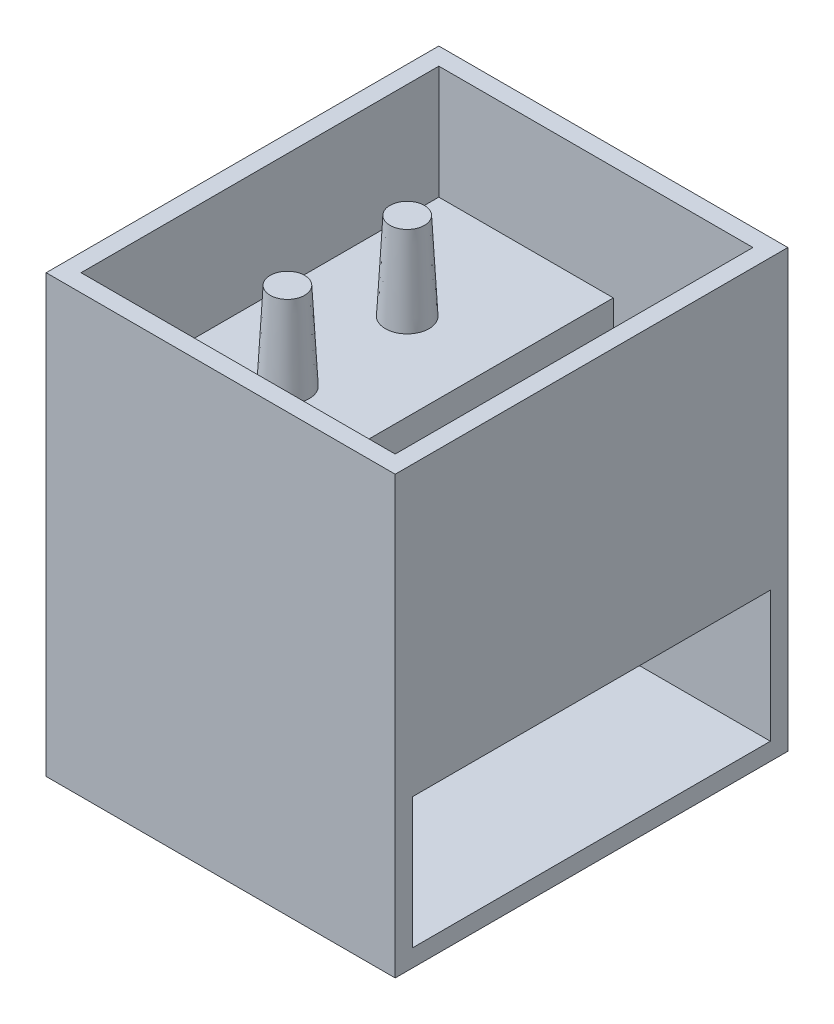
ISO-10303-21;
HEADER;
FILE_DESCRIPTION(('STEP AP214'),'2;1');
FILE_NAME('part.step','',(''),(''),'','','');
FILE_SCHEMA(('AUTOMOTIVE_DESIGN { 1 0 10303 214 1 1 1 1 }'));
ENDSEC;
DATA;
#1=APPLICATION_CONTEXT('core data for automotive mechanical design processes');
#2=APPLICATION_PROTOCOL_DEFINITION('international standard','automotive_design',2000,#1);
#3=PRODUCT_CONTEXT('',#1,'mechanical');
#4=PRODUCT('Part','Part','',(#3));
#5=PRODUCT_RELATED_PRODUCT_CATEGORY('part','',(#4));
#6=PRODUCT_DEFINITION_FORMATION('','',#4);
#7=PRODUCT_DEFINITION_CONTEXT('part definition',#1,'design');
#8=PRODUCT_DEFINITION('design','',#6,#7);
#9=PRODUCT_DEFINITION_SHAPE('','',#8);
#10=(LENGTH_UNIT() NAMED_UNIT(*) SI_UNIT(.MILLI.,.METRE.));
#11=(NAMED_UNIT(*) PLANE_ANGLE_UNIT() SI_UNIT($,.RADIAN.));
#12=(NAMED_UNIT(*) SI_UNIT($,.STERADIAN.) SOLID_ANGLE_UNIT());
#13=UNCERTAINTY_MEASURE_WITH_UNIT(LENGTH_MEASURE(1.E-05),#10,'distance_accuracy_value','');
#14=(GEOMETRIC_REPRESENTATION_CONTEXT(3) GLOBAL_UNCERTAINTY_ASSIGNED_CONTEXT((#13)) GLOBAL_UNIT_ASSIGNED_CONTEXT((#10,
#11,#12)) REPRESENTATION_CONTEXT('',''));
#15=CARTESIAN_POINT('',(0.,0.,0.));
#16=DIRECTION('',(0.,0.,1.));
#17=DIRECTION('',(1.,0.,0.));
#18=AXIS2_PLACEMENT_3D('',#15,#16,#17);
#19=CARTESIAN_POINT('',(-32.8887004628611,50.,-14.0503463635909));
#20=DIRECTION('',(1.,0.,0.));
#21=DIRECTION('',(0.,0.,-1.));
#22=AXIS2_PLACEMENT_3D('',#19,#20,#21);
#23=PLANE('',#22);
#24=DIRECTION('',(0.,-1.,0.));
#25=VECTOR('',#24,1.);
#26=CARTESIAN_POINT('',(-32.8887004628611,50.,28.9496536364091));
#27=LINE('',#26,#25);
#28=CARTESIAN_POINT('',(-32.8887004628611,50.,28.9496536364091));
#29=VERTEX_POINT('',#28);
#30=CARTESIAN_POINT('',(-32.8887004628611,37.,28.9496536364091));
#31=VERTEX_POINT('',#30);
#32=EDGE_CURVE('E193',#29,#31,#27,.T.);
#33=ORIENTED_EDGE('',*,*,#32,.T.);
#34=DIRECTION('',(0.,0.,1.));
#35=VECTOR('',#34,1.);
#36=CARTESIAN_POINT('',(-32.8887004628611,37.,-12.0503463635909));
#37=LINE('',#36,#35);
#38=CARTESIAN_POINT('',(-32.8887004628611,37.,-12.0503463635909));
#39=VERTEX_POINT('',#38);
#40=EDGE_CURVE('E158',#39,#31,#37,.T.);
#41=ORIENTED_EDGE('',*,*,#40,.F.);
#42=DIRECTION('',(0.,-1.,0.));
#43=VECTOR('',#42,1.);
#44=CARTESIAN_POINT('',(-32.8887004628611,50.,-12.0503463635909));
#45=LINE('',#44,#43);
#46=CARTESIAN_POINT('',(-32.8887004628611,50.,-12.0503463635909));
#47=VERTEX_POINT('',#46);
#48=EDGE_CURVE('E140',#47,#39,#45,.T.);
#49=ORIENTED_EDGE('',*,*,#48,.F.);
#50=DIRECTION('',(0.,0.,1.));
#51=VECTOR('',#50,1.);
#52=CARTESIAN_POINT('',(-32.8887004628611,50.,-14.0503463635909));
#53=LINE('',#52,#51);
#54=EDGE_CURVE('E210',#47,#29,#53,.T.);
#55=ORIENTED_EDGE('',*,*,#54,.T.);
#56=EDGE_LOOP('',(#33,#41,#49,#55));
#57=FACE_BOUND('',#56,.T.);
#58=ADVANCED_FACE('F33',(#57),#23,.T.);
#59=CARTESIAN_POINT('',(-32.8887004628611,27.,-12.0503463635909));
#60=VERTEX_POINT('',#59);
#61=CARTESIAN_POINT('',(-32.8887004628611,2.,-12.0503463635909));
#62=VERTEX_POINT('',#61);
#63=EDGE_CURVE('E200',#60,#62,#45,.T.);
#64=ORIENTED_EDGE('',*,*,#63,.F.);
#65=DIRECTION('',(0.,0.,-1.));
#66=VECTOR('',#65,1.);
#67=CARTESIAN_POINT('',(-32.8887004628611,27.,-12.0503463635909));
#68=LINE('',#67,#66);
#69=CARTESIAN_POINT('',(-32.8887004628611,27.,28.9496536364091));
#70=VERTEX_POINT('',#69);
#71=EDGE_CURVE('E155',#70,#60,#68,.T.);
#72=ORIENTED_EDGE('',*,*,#71,.F.);
#73=CARTESIAN_POINT('',(-32.8887004628611,2.,28.9496536364091));
#74=VERTEX_POINT('',#73);
#75=EDGE_CURVE('E197',#70,#74,#27,.T.);
#76=ORIENTED_EDGE('',*,*,#75,.T.);
#77=DIRECTION('',(0.,0.,1.));
#78=VECTOR('',#77,1.);
#79=CARTESIAN_POINT('',(-32.8887004628611,2.,-14.0503463635909));
#80=LINE('',#79,#78);
#81=EDGE_CURVE('E189',#62,#74,#80,.T.);
#82=ORIENTED_EDGE('',*,*,#81,.F.);
#83=EDGE_LOOP('',(#64,#72,#76,#82));
#84=FACE_BOUND('',#83,.T.);
#85=ADVANCED_FACE('F268',(#84),#23,.T.);
#86=CARTESIAN_POINT('',(-34.8887004628611,50.,28.9496536364091));
#87=DIRECTION('',(0.,0.,-1.));
#88=DIRECTION('',(-1.,0.,0.));
#89=AXIS2_PLACEMENT_3D('',#86,#87,#88);
#90=PLANE('',#89);
#91=DIRECTION('',(0.,-1.,0.));
#92=VECTOR('',#91,1.);
#93=CARTESIAN_POINT('',(-12.8887004628611,27.,28.9496536364091));
#94=LINE('',#93,#92);
#95=CARTESIAN_POINT('',(-12.8887004628611,37.,28.9496536364091));
#96=VERTEX_POINT('',#95);
#97=CARTESIAN_POINT('',(-12.8887004628611,27.,28.9496536364091));
#98=VERTEX_POINT('',#97);
#99=EDGE_CURVE('E52',#96,#98,#94,.T.);
#100=ORIENTED_EDGE('',*,*,#99,.F.);
#101=DIRECTION('',(-1.,0.,0.));
#102=VECTOR('',#101,1.);
#103=CARTESIAN_POINT('',(-12.8887004628611,37.,28.9496536364091));
#104=LINE('',#103,#102);
#105=EDGE_CURVE('E144',#96,#31,#104,.T.);
#106=ORIENTED_EDGE('',*,*,#105,.T.);
#107=ORIENTED_EDGE('',*,*,#32,.F.);
#108=DIRECTION('',(1.,0.,0.));
#109=VECTOR('',#108,1.);
#110=CARTESIAN_POINT('',(-34.8887004628611,50.,28.9496536364091));
#111=LINE('',#110,#109);
#112=CARTESIAN_POINT('',(3.11129953713887,50.,28.9496536364091));
#113=VERTEX_POINT('',#112);
#114=EDGE_CURVE('E212',#29,#113,#111,.T.);
#115=ORIENTED_EDGE('',*,*,#114,.T.);
#116=DIRECTION('',(0.,-1.,0.));
#117=VECTOR('',#116,1.);
#118=CARTESIAN_POINT('',(3.11129953713887,50.,28.9496536364091));
#119=LINE('',#118,#117);
#120=CARTESIAN_POINT('',(3.11129953713887,17.,28.9496536364091));
#121=VERTEX_POINT('',#120);
#122=EDGE_CURVE('E203',#113,#121,#119,.T.);
#123=ORIENTED_EDGE('',*,*,#122,.T.);
#124=DIRECTION('',(-1.,0.,0.));
#125=VECTOR('',#124,1.);
#126=CARTESIAN_POINT('',(6.11129953713887,17.,28.9496536364091));
#127=LINE('',#126,#125);
#128=CARTESIAN_POINT('',(5.11129953713887,17.,28.9496536364091));
#129=VERTEX_POINT('',#128);
#130=EDGE_CURVE('E173',#129,#121,#127,.T.);
#131=ORIENTED_EDGE('',*,*,#130,.F.);
#132=DIRECTION('',(0.,1.,0.));
#133=VECTOR('',#132,1.);
#134=CARTESIAN_POINT('',(5.11129953713887,50.,28.9496536364091));
#135=LINE('',#134,#133);
#136=CARTESIAN_POINT('',(5.11129953713887,2.,28.9496536364091));
#137=VERTEX_POINT('',#136);
#138=EDGE_CURVE('E180',#137,#129,#135,.T.);
#139=ORIENTED_EDGE('',*,*,#138,.F.);
#140=DIRECTION('',(1.,0.,0.));
#141=VECTOR('',#140,1.);
#142=CARTESIAN_POINT('',(-34.8887004628611,2.,28.9496536364091));
#143=LINE('',#142,#141);
#144=EDGE_CURVE('E192',#74,#137,#143,.T.);
#145=ORIENTED_EDGE('',*,*,#144,.F.);
#146=ORIENTED_EDGE('',*,*,#75,.F.);
#147=DIRECTION('',(-1.,0.,0.));
#148=VECTOR('',#147,1.);
#149=CARTESIAN_POINT('',(-12.8887004628611,27.,28.9496536364091));
#150=LINE('',#149,#148);
#151=EDGE_CURVE('E48',#98,#70,#150,.T.);
#152=ORIENTED_EDGE('',*,*,#151,.F.);
#153=EDGE_LOOP('',(#100,#106,#107,#115,#123,#131,#139,#145,#146,#152));
#154=FACE_BOUND('',#153,.T.);
#155=ADVANCED_FACE('F274',(#154),#90,.T.);
#156=CARTESIAN_POINT('',(-34.8887004628611,50.,-12.0503463635909));
#157=DIRECTION('',(0.,0.,1.));
#158=DIRECTION('',(1.,0.,0.));
#159=AXIS2_PLACEMENT_3D('',#156,#157,#158);
#160=PLANE('',#159);
#161=ORIENTED_EDGE('',*,*,#48,.T.);
#162=DIRECTION('',(-1.,0.,0.));
#163=VECTOR('',#162,1.);
#164=CARTESIAN_POINT('',(-12.8887004628611,37.,-12.0503463635909));
#165=LINE('',#164,#163);
#166=CARTESIAN_POINT('',(-12.8887004628611,37.,-12.0503463635909));
#167=VERTEX_POINT('',#166);
#168=EDGE_CURVE('E133',#167,#39,#165,.T.);
#169=ORIENTED_EDGE('',*,*,#168,.F.);
#170=DIRECTION('',(0.,1.,0.));
#171=VECTOR('',#170,1.);
#172=CARTESIAN_POINT('',(-12.8887004628611,27.,-12.0503463635909));
#173=LINE('',#172,#171);
#174=CARTESIAN_POINT('',(-12.8887004628611,27.,-12.0503463635909));
#175=VERTEX_POINT('',#174);
#176=EDGE_CURVE('E137',#175,#167,#173,.T.);
#177=ORIENTED_EDGE('',*,*,#176,.F.);
#178=DIRECTION('',(-1.,0.,0.));
#179=VECTOR('',#178,1.);
#180=CARTESIAN_POINT('',(-12.8887004628611,27.,-12.0503463635909));
#181=LINE('',#180,#179);
#182=EDGE_CURVE('E166',#175,#60,#181,.T.);
#183=ORIENTED_EDGE('',*,*,#182,.T.);
#184=ORIENTED_EDGE('',*,*,#63,.T.);
#185=DIRECTION('',(-1.,0.,0.));
#186=VECTOR('',#185,1.);
#187=CARTESIAN_POINT('',(-34.8887004628611,2.,-12.0503463635909));
#188=LINE('',#187,#186);
#189=CARTESIAN_POINT('',(5.11129953713887,2.,-12.0503463635909));
#190=VERTEX_POINT('',#189);
#191=EDGE_CURVE('E202',#190,#62,#188,.T.);
#192=ORIENTED_EDGE('',*,*,#191,.F.);
#193=DIRECTION('',(0.,-1.,0.));
#194=VECTOR('',#193,1.);
#195=CARTESIAN_POINT('',(5.11129953713886,50.,-12.0503463635909));
#196=LINE('',#195,#194);
#197=CARTESIAN_POINT('',(5.11129953713887,17.,-12.0503463635909));
#198=VERTEX_POINT('',#197);
#199=EDGE_CURVE('E186',#198,#190,#196,.T.);
#200=ORIENTED_EDGE('',*,*,#199,.F.);
#201=DIRECTION('',(-1.,0.,0.));
#202=VECTOR('',#201,1.);
#203=CARTESIAN_POINT('',(6.11129953713886,17.,-12.0503463635909));
#204=LINE('',#203,#202);
#205=CARTESIAN_POINT('',(3.11129953713886,17.,-12.0503463635909));
#206=VERTEX_POINT('',#205);
#207=EDGE_CURVE('E174',#198,#206,#204,.T.);
#208=ORIENTED_EDGE('',*,*,#207,.T.);
#209=DIRECTION('',(0.,-1.,0.));
#210=VECTOR('',#209,1.);
#211=CARTESIAN_POINT('',(3.11129953713887,50.,-12.0503463635909));
#212=LINE('',#211,#210);
#213=CARTESIAN_POINT('',(3.11129953713886,50.,-12.0503463635909));
#214=VERTEX_POINT('',#213);
#215=EDGE_CURVE('E199',#214,#206,#212,.T.);
#216=ORIENTED_EDGE('',*,*,#215,.F.);
#217=DIRECTION('',(-1.,0.,0.));
#218=VECTOR('',#217,1.);
#219=CARTESIAN_POINT('',(-34.8887004628611,50.,-12.0503463635909));
#220=LINE('',#219,#218);
#221=EDGE_CURVE('E217',#214,#47,#220,.T.);
#222=ORIENTED_EDGE('',*,*,#221,.T.);
#223=EDGE_LOOP('',(#161,#169,#177,#183,#184,#192,#200,#208,#216,#222));
#224=FACE_BOUND('',#223,.T.);
#225=ADVANCED_FACE('F135',(#224),#160,.T.);
#226=CARTESIAN_POINT('',(-34.8887004628611,50.,-14.0503463635909));
#227=DIRECTION('',(1.,0.,0.));
#228=DIRECTION('',(0.,0.,-1.));
#229=AXIS2_PLACEMENT_3D('',#226,#227,#228);
#230=PLANE('',#229);
#231=DIRECTION('',(0.,0.,1.));
#232=VECTOR('',#231,1.);
#233=CARTESIAN_POINT('',(-34.8887004628611,0.,-14.0503463635909));
#234=LINE('',#233,#232);
#235=CARTESIAN_POINT('',(-34.8887004628611,0.,-14.0503463635909));
#236=VERTEX_POINT('',#235);
#237=CARTESIAN_POINT('',(-34.8887004628611,0.,30.9496536364091));
#238=VERTEX_POINT('',#237);
#239=EDGE_CURVE('E196',#236,#238,#234,.T.);
#240=ORIENTED_EDGE('',*,*,#239,.T.);
#241=DIRECTION('',(0.,-1.,0.));
#242=VECTOR('',#241,1.);
#243=CARTESIAN_POINT('',(-34.8887004628611,50.,30.9496536364091));
#244=LINE('',#243,#242);
#245=CARTESIAN_POINT('',(-34.8887004628611,50.,30.9496536364091));
#246=VERTEX_POINT('',#245);
#247=EDGE_CURVE('E245',#246,#238,#244,.T.);
#248=ORIENTED_EDGE('',*,*,#247,.F.);
#249=DIRECTION('',(0.,0.,1.));
#250=VECTOR('',#249,1.);
#251=CARTESIAN_POINT('',(-34.8887004628611,50.,-14.0503463635909));
#252=LINE('',#251,#250);
#253=CARTESIAN_POINT('',(-34.8887004628611,50.,-14.0503463635909));
#254=VERTEX_POINT('',#253);
#255=EDGE_CURVE('E219',#254,#246,#252,.T.);
#256=ORIENTED_EDGE('',*,*,#255,.F.);
#257=DIRECTION('',(0.,-1.,0.));
#258=VECTOR('',#257,1.);
#259=CARTESIAN_POINT('',(-34.8887004628611,50.,-14.0503463635909));
#260=LINE('',#259,#258);
#261=EDGE_CURVE('E229',#254,#236,#260,.T.);
#262=ORIENTED_EDGE('',*,*,#261,.T.);
#263=EDGE_LOOP('',(#240,#248,#256,#262));
#264=FACE_BOUND('',#263,.T.);
#265=ADVANCED_FACE('F35',(#264),#230,.F.);
#266=CARTESIAN_POINT('',(-34.8887004628611,50.,30.9496536364091));
#267=DIRECTION('',(0.,0.,-1.));
#268=DIRECTION('',(-1.,0.,0.));
#269=AXIS2_PLACEMENT_3D('',#266,#267,#268);
#270=PLANE('',#269);
#271=DIRECTION('',(1.,0.,0.));
#272=VECTOR('',#271,1.);
#273=CARTESIAN_POINT('',(-34.8887004628611,0.,30.9496536364091));
#274=LINE('',#273,#272);
#275=CARTESIAN_POINT('',(5.11129953713887,0.,30.9496536364091));
#276=VERTEX_POINT('',#275);
#277=EDGE_CURVE('E232',#238,#276,#274,.T.);
#278=ORIENTED_EDGE('',*,*,#277,.T.);
#279=DIRECTION('',(0.,-1.,0.));
#280=VECTOR('',#279,1.);
#281=CARTESIAN_POINT('',(5.11129953713887,50.,30.9496536364091));
#282=LINE('',#281,#280);
#283=CARTESIAN_POINT('',(5.11129953713887,50.,30.9496536364091));
#284=VERTEX_POINT('',#283);
#285=EDGE_CURVE('E242',#284,#276,#282,.T.);
#286=ORIENTED_EDGE('',*,*,#285,.F.);
#287=DIRECTION('',(1.,0.,0.));
#288=VECTOR('',#287,1.);
#289=CARTESIAN_POINT('',(-34.8887004628611,50.,30.9496536364091));
#290=LINE('',#289,#288);
#291=EDGE_CURVE('E222',#246,#284,#290,.T.);
#292=ORIENTED_EDGE('',*,*,#291,.F.);
#293=ORIENTED_EDGE('',*,*,#247,.T.);
#294=EDGE_LOOP('',(#278,#286,#292,#293));
#295=FACE_BOUND('',#294,.T.);
#296=ADVANCED_FACE('F302',(#295),#270,.F.);
#297=CARTESIAN_POINT('',(5.11129953713886,50.,-14.0503463635909));
#298=DIRECTION('',(-1.,0.,0.));
#299=DIRECTION('',(0.,0.,1.));
#300=AXIS2_PLACEMENT_3D('',#297,#298,#299);
#301=PLANE('',#300);
#302=DIRECTION('',(0.,0.,-1.));
#303=VECTOR('',#302,1.);
#304=CARTESIAN_POINT('',(5.11129953713886,17.,-14.0503463635909));
#305=LINE('',#304,#303);
#306=EDGE_CURVE('E183',#129,#198,#305,.T.);
#307=ORIENTED_EDGE('',*,*,#306,.T.);
#308=ORIENTED_EDGE('',*,*,#199,.T.);
#309=DIRECTION('',(0.,0.,1.));
#310=VECTOR('',#309,1.);
#311=CARTESIAN_POINT('',(5.11129953713886,2.,-14.0503463635909));
#312=LINE('',#311,#310);
#313=EDGE_CURVE('E176',#190,#137,#312,.T.);
#314=ORIENTED_EDGE('',*,*,#313,.T.);
#315=ORIENTED_EDGE('',*,*,#138,.T.);
#316=EDGE_LOOP('',(#307,#308,#314,#315));
#317=FACE_BOUND('',#316,.T.);
#318=DIRECTION('',(0.,0.,-1.));
#319=VECTOR('',#318,1.);
#320=CARTESIAN_POINT('',(5.11129953713886,0.,-14.0503463635909));
#321=LINE('',#320,#319);
#322=CARTESIAN_POINT('',(5.11129953713886,0.,-14.0503463635909));
#323=VERTEX_POINT('',#322);
#324=EDGE_CURVE('E234',#276,#323,#321,.T.);
#325=ORIENTED_EDGE('',*,*,#324,.T.);
#326=DIRECTION('',(0.,-1.,0.));
#327=VECTOR('',#326,1.);
#328=CARTESIAN_POINT('',(5.11129953713886,50.,-14.0503463635909));
#329=LINE('',#328,#327);
#330=CARTESIAN_POINT('',(5.11129953713886,50.,-14.0503463635909));
#331=VERTEX_POINT('',#330);
#332=EDGE_CURVE('E239',#331,#323,#329,.T.);
#333=ORIENTED_EDGE('',*,*,#332,.F.);
#334=DIRECTION('',(0.,0.,-1.));
#335=VECTOR('',#334,1.);
#336=CARTESIAN_POINT('',(5.11129953713886,50.,-14.0503463635909));
#337=LINE('',#336,#335);
#338=EDGE_CURVE('E225',#284,#331,#337,.T.);
#339=ORIENTED_EDGE('',*,*,#338,.F.);
#340=ORIENTED_EDGE('',*,*,#285,.T.);
#341=EDGE_LOOP('',(#325,#333,#339,#340));
#342=FACE_BOUND('',#341,.T.);
#343=ADVANCED_FACE('F299',(#317,#342),#301,.F.);
#344=CARTESIAN_POINT('',(-34.8887004628611,50.,-14.0503463635909));
#345=DIRECTION('',(0.,0.,1.));
#346=DIRECTION('',(1.,0.,0.));
#347=AXIS2_PLACEMENT_3D('',#344,#345,#346);
#348=PLANE('',#347);
#349=DIRECTION('',(-1.,0.,0.));
#350=VECTOR('',#349,1.);
#351=CARTESIAN_POINT('',(-34.8887004628611,0.,-14.0503463635909));
#352=LINE('',#351,#350);
#353=EDGE_CURVE('E223',#323,#236,#352,.T.);
#354=ORIENTED_EDGE('',*,*,#353,.T.);
#355=ORIENTED_EDGE('',*,*,#261,.F.);
#356=DIRECTION('',(-1.,0.,0.));
#357=VECTOR('',#356,1.);
#358=CARTESIAN_POINT('',(-34.8887004628611,50.,-14.0503463635909));
#359=LINE('',#358,#357);
#360=EDGE_CURVE('E227',#331,#254,#359,.T.);
#361=ORIENTED_EDGE('',*,*,#360,.F.);
#362=ORIENTED_EDGE('',*,*,#332,.T.);
#363=EDGE_LOOP('',(#354,#355,#361,#362));
#364=FACE_BOUND('',#363,.T.);
#365=ADVANCED_FACE('F292',(#364),#348,.F.);
#366=CARTESIAN_POINT('',(0.,50.,0.));
#367=DIRECTION('',(0.,1.,0.));
#368=DIRECTION('',(0.,0.,1.));
#369=AXIS2_PLACEMENT_3D('',#366,#367,#368);
#370=PLANE('',#369);
#371=ORIENTED_EDGE('',*,*,#54,.F.);
#372=ORIENTED_EDGE('',*,*,#221,.F.);
#373=DIRECTION('',(0.,0.,-1.));
#374=VECTOR('',#373,1.);
#375=CARTESIAN_POINT('',(3.11129953713886,50.,-14.0503463635909));
#376=LINE('',#375,#374);
#377=EDGE_CURVE('E214',#113,#214,#376,.T.);
#378=ORIENTED_EDGE('',*,*,#377,.F.);
#379=ORIENTED_EDGE('',*,*,#114,.F.);
#380=EDGE_LOOP('',(#371,#372,#378,#379));
#381=FACE_BOUND('',#380,.T.);
#382=ORIENTED_EDGE('',*,*,#255,.T.);
#383=ORIENTED_EDGE('',*,*,#291,.T.);
#384=ORIENTED_EDGE('',*,*,#338,.T.);
#385=ORIENTED_EDGE('',*,*,#360,.T.);
#386=EDGE_LOOP('',(#382,#383,#384,#385));
#387=FACE_BOUND('',#386,.T.);
#388=ADVANCED_FACE('F289',(#381,#387),#370,.T.);
#389=CARTESIAN_POINT('',(0.,0.,0.));
#390=DIRECTION('',(0.,1.,0.));
#391=DIRECTION('',(0.,0.,1.));
#392=AXIS2_PLACEMENT_3D('',#389,#390,#391);
#393=PLANE('',#392);
#394=ORIENTED_EDGE('',*,*,#239,.F.);
#395=ORIENTED_EDGE('',*,*,#353,.F.);
#396=ORIENTED_EDGE('',*,*,#324,.F.);
#397=ORIENTED_EDGE('',*,*,#277,.F.);
#398=EDGE_LOOP('',(#394,#395,#396,#397));
#399=FACE_BOUND('',#398,.T.);
#400=ADVANCED_FACE('F282',(#399),#393,.F.);
#401=CARTESIAN_POINT('',(3.11129953713886,50.,-14.0503463635909));
#402=DIRECTION('',(-1.,0.,0.));
#403=DIRECTION('',(0.,0.,1.));
#404=AXIS2_PLACEMENT_3D('',#401,#402,#403);
#405=PLANE('',#404);
#406=DIRECTION('',(0.,0.,-1.));
#407=VECTOR('',#406,1.);
#408=CARTESIAN_POINT('',(3.11129953713886,17.,-12.0503463635909));
#409=LINE('',#408,#407);
#410=EDGE_CURVE('E143',#121,#206,#409,.T.);
#411=ORIENTED_EDGE('',*,*,#410,.F.);
#412=ORIENTED_EDGE('',*,*,#122,.F.);
#413=ORIENTED_EDGE('',*,*,#377,.T.);
#414=ORIENTED_EDGE('',*,*,#215,.T.);
#415=EDGE_LOOP('',(#411,#412,#413,#414));
#416=FACE_BOUND('',#415,.T.);
#417=ADVANCED_FACE('F279',(#416),#405,.T.);
#418=CARTESIAN_POINT('',(0.,2.,0.));
#419=DIRECTION('',(0.,1.,0.));
#420=DIRECTION('',(0.,0.,1.));
#421=AXIS2_PLACEMENT_3D('',#418,#419,#420);
#422=PLANE('',#421);
#423=ORIENTED_EDGE('',*,*,#81,.T.);
#424=ORIENTED_EDGE('',*,*,#144,.T.);
#425=ORIENTED_EDGE('',*,*,#313,.F.);
#426=ORIENTED_EDGE('',*,*,#191,.T.);
#427=EDGE_LOOP('',(#423,#424,#425,#426));
#428=FACE_BOUND('',#427,.T.);
#429=ADVANCED_FACE('F263',(#428),#422,.T.);
#430=CARTESIAN_POINT('',(6.11129953713886,17.,-12.0503463635909));
#431=DIRECTION('',(0.,1.,0.));
#432=DIRECTION('',(0.,0.,1.));
#433=AXIS2_PLACEMENT_3D('',#430,#431,#432);
#434=PLANE('',#433);
#435=ORIENTED_EDGE('',*,*,#130,.T.);
#436=ORIENTED_EDGE('',*,*,#410,.T.);
#437=ORIENTED_EDGE('',*,*,#207,.F.);
#438=ORIENTED_EDGE('',*,*,#306,.F.);
#439=EDGE_LOOP('',(#435,#436,#437,#438));
#440=FACE_BOUND('',#439,.T.);
#441=ADVANCED_FACE('F254',(#440),#434,.F.);
#442=CARTESIAN_POINT('',(-12.8887004628611,37.,-12.0503463635909));
#443=DIRECTION('',(0.,-1.,0.));
#444=DIRECTION('',(0.,0.,-1.));
#445=AXIS2_PLACEMENT_3D('',#442,#443,#444);
#446=PLANE('',#445);
#447=CARTESIAN_POINT('',(-22.8101808199224,37.,15.377942677965));
#448=DIRECTION('',(0.,-1.,0.));
#449=DIRECTION('',(0.,0.,-1.));
#450=AXIS2_PLACEMENT_3D('',#447,#448,#449);
#451=CIRCLE('',#450,2.5);
#452=CARTESIAN_POINT('',(-22.8101808199224,37.,12.877942677965));
#453=VERTEX_POINT('',#452);
#454=EDGE_CURVE('E11',#453,#453,#451,.F.);
#455=ORIENTED_EDGE('',*,*,#454,.F.);
#456=EDGE_LOOP('',(#455));
#457=FACE_BOUND('',#456,.T.);
#458=CARTESIAN_POINT('',(-22.8887004628611,37.,1.572936471131));
#459=DIRECTION('',(0.,-1.,0.));
#460=DIRECTION('',(0.,0.,-1.));
#461=AXIS2_PLACEMENT_3D('',#458,#459,#460);
#462=CIRCLE('',#461,2.5);
#463=CARTESIAN_POINT('',(-22.8887004628611,37.,-0.927063528869002));
#464=VERTEX_POINT('',#463);
#465=EDGE_CURVE('E41',#464,#464,#462,.F.);
#466=ORIENTED_EDGE('',*,*,#465,.F.);
#467=EDGE_LOOP('',(#466));
#468=FACE_BOUND('',#467,.T.);
#469=ORIENTED_EDGE('',*,*,#40,.T.);
#470=ORIENTED_EDGE('',*,*,#105,.F.);
#471=DIRECTION('',(0.,0.,1.));
#472=VECTOR('',#471,1.);
#473=CARTESIAN_POINT('',(-12.8887004628611,37.,-12.0503463635909));
#474=LINE('',#473,#472);
#475=EDGE_CURVE('E147',#167,#96,#474,.T.);
#476=ORIENTED_EDGE('',*,*,#475,.F.);
#477=ORIENTED_EDGE('',*,*,#168,.T.);
#478=EDGE_LOOP('',(#469,#470,#476,#477));
#479=FACE_BOUND('',#478,.T.);
#480=ADVANCED_FACE('F148',(#457,#468,#479),#446,.F.);
#481=CARTESIAN_POINT('',(-12.8887004628611,27.,-12.0503463635909));
#482=DIRECTION('',(0.,1.,0.));
#483=DIRECTION('',(0.,0.,1.));
#484=AXIS2_PLACEMENT_3D('',#481,#482,#483);
#485=PLANE('',#484);
#486=ORIENTED_EDGE('',*,*,#71,.T.);
#487=ORIENTED_EDGE('',*,*,#182,.F.);
#488=DIRECTION('',(0.,0.,-1.));
#489=VECTOR('',#488,1.);
#490=CARTESIAN_POINT('',(-12.8887004628611,27.,-12.0503463635909));
#491=LINE('',#490,#489);
#492=EDGE_CURVE('E153',#98,#175,#491,.T.);
#493=ORIENTED_EDGE('',*,*,#492,.F.);
#494=ORIENTED_EDGE('',*,*,#151,.T.);
#495=EDGE_LOOP('',(#486,#487,#493,#494));
#496=FACE_BOUND('',#495,.T.);
#497=ADVANCED_FACE('F253',(#496),#485,.F.);
#498=CARTESIAN_POINT('',(-12.8887004628611,0.,0.));
#499=DIRECTION('',(1.,0.,0.));
#500=DIRECTION('',(0.,0.,-1.));
#501=AXIS2_PLACEMENT_3D('',#498,#499,#500);
#502=PLANE('',#501);
#503=ORIENTED_EDGE('',*,*,#176,.T.);
#504=ORIENTED_EDGE('',*,*,#475,.T.);
#505=ORIENTED_EDGE('',*,*,#99,.T.);
#506=ORIENTED_EDGE('',*,*,#492,.T.);
#507=EDGE_LOOP('',(#503,#504,#505,#506));
#508=FACE_BOUND('',#507,.T.);
#509=ADVANCED_FACE('F151',(#508),#502,.T.);
#510=CARTESIAN_POINT('',(-22.8887004628611,37.,1.572936471131));
#511=DIRECTION('',(0.,-1.,0.));
#512=DIRECTION('',(0.,0.,1.));
#513=AXIS2_PLACEMENT_3D('',#510,#511,#512);
#514=CONICAL_SURFACE('',#513,2.5,0.0523598775598299);
#515=CARTESIAN_POINT('',(-22.8887004628611,47.,1.572936471131));
#516=DIRECTION('',(0.,1.,0.));
#517=DIRECTION('',(0.,0.,1.));
#518=AXIS2_PLACEMENT_3D('',#515,#516,#517);
#519=CIRCLE('',#518,1.97592220716959);
#520=CARTESIAN_POINT('',(-22.8887004628611,47.,3.54885867830059));
#521=VERTEX_POINT('',#520);
#522=EDGE_CURVE('E161',#521,#521,#519,.T.);
#523=ORIENTED_EDGE('',*,*,#522,.F.);
#524=EDGE_LOOP('',(#523));
#525=FACE_BOUND('',#524,.T.);
#526=ORIENTED_EDGE('',*,*,#465,.T.);
#527=EDGE_LOOP('',(#526));
#528=FACE_BOUND('',#527,.T.);
#529=ADVANCED_FACE('F250',(#525,#528),#514,.T.);
#530=CARTESIAN_POINT('',(-22.8887004628611,47.,1.572936471131));
#531=DIRECTION('',(0.,1.,0.));
#532=DIRECTION('',(0.,0.,1.));
#533=AXIS2_PLACEMENT_3D('',#530,#531,#532);
#534=PLANE('',#533);
#535=ORIENTED_EDGE('',*,*,#522,.T.);
#536=EDGE_LOOP('',(#535));
#537=FACE_BOUND('',#536,.T.);
#538=ADVANCED_FACE('F429',(#537),#534,.T.);
#539=CARTESIAN_POINT('',(-22.8101808199224,37.,15.377942677965));
#540=DIRECTION('',(0.,-1.,0.));
#541=DIRECTION('',(0.,0.,1.));
#542=AXIS2_PLACEMENT_3D('',#539,#540,#541);
#543=CONICAL_SURFACE('',#542,2.5,0.0523598775598299);
#544=CARTESIAN_POINT('',(-22.8101808199224,47.,15.377942677965));
#545=DIRECTION('',(0.,1.,0.));
#546=DIRECTION('',(0.,0.,1.));
#547=AXIS2_PLACEMENT_3D('',#544,#545,#546);
#548=CIRCLE('',#547,1.97592220716959);
#549=CARTESIAN_POINT('',(-22.8101808199224,47.,17.3538648851346));
#550=VERTEX_POINT('',#549);
#551=EDGE_CURVE('E464',#550,#550,#548,.T.);
#552=ORIENTED_EDGE('',*,*,#551,.F.);
#553=EDGE_LOOP('',(#552));
#554=FACE_BOUND('',#553,.T.);
#555=ORIENTED_EDGE('',*,*,#454,.T.);
#556=EDGE_LOOP('',(#555));
#557=FACE_BOUND('',#556,.T.);
#558=ADVANCED_FACE('F437',(#554,#557),#543,.T.);
#559=CARTESIAN_POINT('',(-22.8101808199224,47.,15.377942677965));
#560=DIRECTION('',(0.,1.,0.));
#561=DIRECTION('',(0.,0.,1.));
#562=AXIS2_PLACEMENT_3D('',#559,#560,#561);
#563=PLANE('',#562);
#564=ORIENTED_EDGE('',*,*,#551,.T.);
#565=EDGE_LOOP('',(#564));
#566=FACE_BOUND('',#565,.T.);
#567=ADVANCED_FACE('F445',(#566),#563,.T.);
#568=CLOSED_SHELL('',(#58,#85,#155,#225,#265,#296,#343,#365,#388,#400,#417,#429,#441,#480,#497,
#509,#529,#538,#558,#567));
#569=MANIFOLD_SOLID_BREP('B2',#568);
#570=ADVANCED_BREP_SHAPE_REPRESENTATION('',(#18,#569),#14);
#571=SHAPE_DEFINITION_REPRESENTATION(#9,#570);
ENDSEC;
END-ISO-10303-21;
